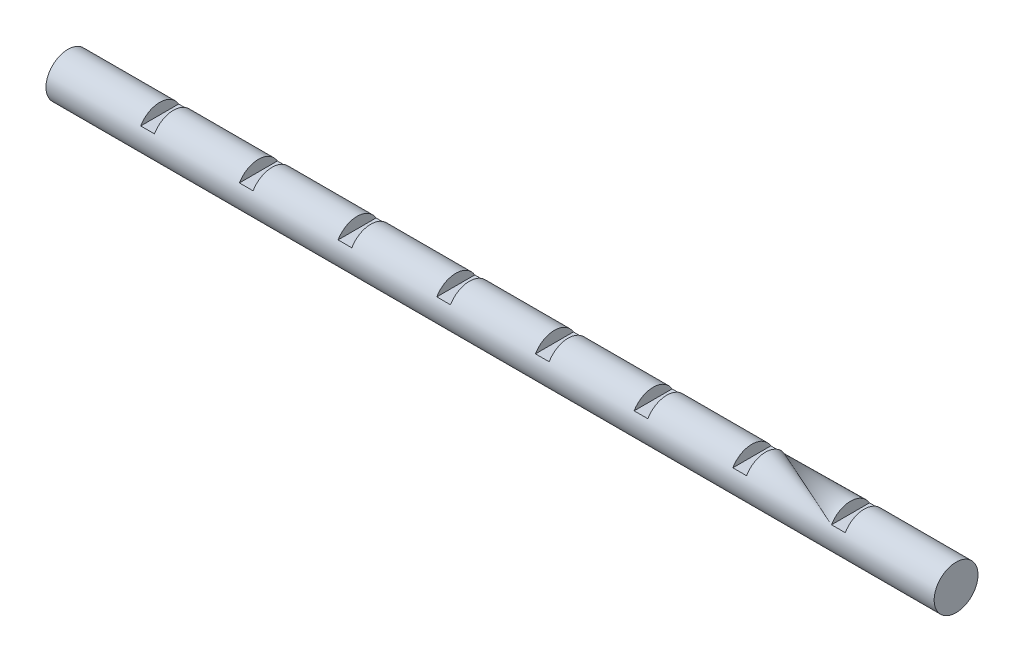
ISO-10303-21;
HEADER;
FILE_DESCRIPTION(('STEP AP214'),'2;1');
FILE_NAME('part.step','',(''),(''),'','','');
FILE_SCHEMA(('AUTOMOTIVE_DESIGN { 1 0 10303 214 1 1 1 1 }'));
ENDSEC;
DATA;
#1=APPLICATION_CONTEXT('core data for automotive mechanical design processes');
#2=APPLICATION_PROTOCOL_DEFINITION('international standard','automotive_design',2000,#1);
#3=PRODUCT_CONTEXT('',#1,'mechanical');
#4=PRODUCT('Part','Part','',(#3));
#5=PRODUCT_RELATED_PRODUCT_CATEGORY('part','',(#4));
#6=PRODUCT_DEFINITION_FORMATION('','',#4);
#7=PRODUCT_DEFINITION_CONTEXT('part definition',#1,'design');
#8=PRODUCT_DEFINITION('design','',#6,#7);
#9=PRODUCT_DEFINITION_SHAPE('','',#8);
#10=(LENGTH_UNIT() NAMED_UNIT(*) SI_UNIT(.MILLI.,.METRE.));
#11=(NAMED_UNIT(*) PLANE_ANGLE_UNIT() SI_UNIT($,.RADIAN.));
#12=(NAMED_UNIT(*) SI_UNIT($,.STERADIAN.) SOLID_ANGLE_UNIT());
#13=UNCERTAINTY_MEASURE_WITH_UNIT(LENGTH_MEASURE(1.E-05),#10,'distance_accuracy_value','');
#14=(GEOMETRIC_REPRESENTATION_CONTEXT(3) GLOBAL_UNCERTAINTY_ASSIGNED_CONTEXT((#13)) GLOBAL_UNIT_ASSIGNED_CONTEXT((#10,
#11,#12)) REPRESENTATION_CONTEXT('',''));
#15=CARTESIAN_POINT('',(0.,0.,0.));
#16=DIRECTION('',(0.,0.,1.));
#17=DIRECTION('',(1.,0.,0.));
#18=AXIS2_PLACEMENT_3D('',#15,#16,#17);
#19=CARTESIAN_POINT('',(81.,0.,0.));
#20=DIRECTION('',(-1.,0.,0.));
#21=DIRECTION('',(0.,0.,1.));
#22=AXIS2_PLACEMENT_3D('',#19,#20,#21);
#23=CYLINDRICAL_SURFACE('',#22,4.);
#24=CARTESIAN_POINT('',(64.25,0.,0.));
#25=DIRECTION('',(-1.,0.,0.));
#26=DIRECTION('',(0.,0.,1.));
#27=AXIS2_PLACEMENT_3D('',#24,#25,#26);
#28=CIRCLE('',#27,4.);
#29=CARTESIAN_POINT('',(64.25,2.,3.46410161513775));
#30=VERTEX_POINT('',#29);
#31=CARTESIAN_POINT('',(64.25,2.,-3.46410161513775));
#32=VERTEX_POINT('',#31);
#33=EDGE_CURVE('E42',#30,#32,#28,.T.);
#34=ORIENTED_EDGE('',*,*,#33,.F.);
#35=DIRECTION('',(-1.,0.,0.));
#36=VECTOR('',#35,1.);
#37=CARTESIAN_POINT('',(81.,2.,3.46410161513775));
#38=LINE('',#37,#36);
#39=CARTESIAN_POINT('',(61.75,2.,3.46410161513775));
#40=VERTEX_POINT('',#39);
#41=EDGE_CURVE('E11',#30,#40,#38,.T.);
#42=ORIENTED_EDGE('',*,*,#41,.T.);
#43=CARTESIAN_POINT('',(61.75,0.,0.));
#44=DIRECTION('',(1.,0.,0.));
#45=DIRECTION('',(0.,0.,-1.));
#46=AXIS2_PLACEMENT_3D('',#43,#44,#45);
#47=CIRCLE('',#46,4.);
#48=CARTESIAN_POINT('',(61.75,2.,-3.46410161513775));
#49=VERTEX_POINT('',#48);
#50=EDGE_CURVE('E153',#49,#40,#47,.T.);
#51=ORIENTED_EDGE('',*,*,#50,.F.);
#52=DIRECTION('',(-1.,0.,0.));
#53=VECTOR('',#52,1.);
#54=CARTESIAN_POINT('',(81.,2.,-3.46410161513775));
#55=LINE('',#54,#53);
#56=EDGE_CURVE('E146',#49,#32,#55,.F.);
#57=ORIENTED_EDGE('',*,*,#56,.T.);
#58=EDGE_LOOP('',(#34,#42,#51,#57));
#59=FACE_BOUND('',#58,.T.);
#60=CARTESIAN_POINT('',(46.25,0.,0.));
#61=DIRECTION('',(-1.,0.,0.));
#62=DIRECTION('',(0.,0.,1.));
#63=AXIS2_PLACEMENT_3D('',#60,#61,#62);
#64=CIRCLE('',#63,4.);
#65=CARTESIAN_POINT('',(46.25,2.,3.46410161513775));
#66=VERTEX_POINT('',#65);
#67=CARTESIAN_POINT('',(46.25,2.,-3.46410161513775));
#68=VERTEX_POINT('',#67);
#69=EDGE_CURVE('E164',#66,#68,#64,.T.);
#70=ORIENTED_EDGE('',*,*,#69,.F.);
#71=DIRECTION('',(-1.,0.,0.));
#72=VECTOR('',#71,1.);
#73=CARTESIAN_POINT('',(81.,2.,3.46410161513775));
#74=LINE('',#73,#72);
#75=CARTESIAN_POINT('',(43.75,2.,3.46410161513775));
#76=VERTEX_POINT('',#75);
#77=EDGE_CURVE('E154',#66,#76,#74,.T.);
#78=ORIENTED_EDGE('',*,*,#77,.T.);
#79=CARTESIAN_POINT('',(43.75,0.,0.));
#80=DIRECTION('',(1.,0.,0.));
#81=DIRECTION('',(0.,0.,-1.));
#82=AXIS2_PLACEMENT_3D('',#79,#80,#81);
#83=CIRCLE('',#82,4.);
#84=CARTESIAN_POINT('',(43.75,2.,-3.46410161513775));
#85=VERTEX_POINT('',#84);
#86=EDGE_CURVE('E166',#85,#76,#83,.T.);
#87=ORIENTED_EDGE('',*,*,#86,.F.);
#88=DIRECTION('',(-1.,0.,0.));
#89=VECTOR('',#88,1.);
#90=CARTESIAN_POINT('',(81.,2.,-3.46410161513775));
#91=LINE('',#90,#89);
#92=EDGE_CURVE('E168',#85,#68,#91,.F.);
#93=ORIENTED_EDGE('',*,*,#92,.T.);
#94=EDGE_LOOP('',(#70,#78,#87,#93));
#95=FACE_BOUND('',#94,.T.);
#96=CARTESIAN_POINT('',(28.25,0.,0.));
#97=DIRECTION('',(-1.,0.,0.));
#98=DIRECTION('',(0.,0.,1.));
#99=AXIS2_PLACEMENT_3D('',#96,#97,#98);
#100=CIRCLE('',#99,4.);
#101=CARTESIAN_POINT('',(28.25,2.,3.46410161513775));
#102=VERTEX_POINT('',#101);
#103=CARTESIAN_POINT('',(28.25,2.,-3.46410161513775));
#104=VERTEX_POINT('',#103);
#105=EDGE_CURVE('E174',#102,#104,#100,.T.);
#106=ORIENTED_EDGE('',*,*,#105,.F.);
#107=DIRECTION('',(-1.,0.,0.));
#108=VECTOR('',#107,1.);
#109=CARTESIAN_POINT('',(81.,2.,3.46410161513775));
#110=LINE('',#109,#108);
#111=CARTESIAN_POINT('',(25.75,2.,3.46410161513775));
#112=VERTEX_POINT('',#111);
#113=EDGE_CURVE('E171',#102,#112,#110,.T.);
#114=ORIENTED_EDGE('',*,*,#113,.T.);
#115=CARTESIAN_POINT('',(25.75,0.,0.));
#116=DIRECTION('',(1.,0.,0.));
#117=DIRECTION('',(0.,0.,-1.));
#118=AXIS2_PLACEMENT_3D('',#115,#116,#117);
#119=CIRCLE('',#118,4.);
#120=CARTESIAN_POINT('',(25.75,2.,-3.46410161513775));
#121=VERTEX_POINT('',#120);
#122=EDGE_CURVE('E177',#121,#112,#119,.T.);
#123=ORIENTED_EDGE('',*,*,#122,.F.);
#124=DIRECTION('',(-1.,0.,0.));
#125=VECTOR('',#124,1.);
#126=CARTESIAN_POINT('',(81.,2.,-3.46410161513775));
#127=LINE('',#126,#125);
#128=EDGE_CURVE('E179',#121,#104,#127,.F.);
#129=ORIENTED_EDGE('',*,*,#128,.T.);
#130=EDGE_LOOP('',(#106,#114,#123,#129));
#131=FACE_BOUND('',#130,.T.);
#132=CARTESIAN_POINT('',(10.25,0.,0.));
#133=DIRECTION('',(-1.,0.,0.));
#134=DIRECTION('',(0.,0.,1.));
#135=AXIS2_PLACEMENT_3D('',#132,#133,#134);
#136=CIRCLE('',#135,4.);
#137=CARTESIAN_POINT('',(10.25,2.,3.46410161513775));
#138=VERTEX_POINT('',#137);
#139=CARTESIAN_POINT('',(10.25,2.,-3.46410161513775));
#140=VERTEX_POINT('',#139);
#141=EDGE_CURVE('E185',#138,#140,#136,.T.);
#142=ORIENTED_EDGE('',*,*,#141,.F.);
#143=DIRECTION('',(-1.,0.,0.));
#144=VECTOR('',#143,1.);
#145=CARTESIAN_POINT('',(81.,2.,3.46410161513775));
#146=LINE('',#145,#144);
#147=CARTESIAN_POINT('',(7.74999999999999,2.,3.46410161513775));
#148=VERTEX_POINT('',#147);
#149=EDGE_CURVE('E182',#138,#148,#146,.T.);
#150=ORIENTED_EDGE('',*,*,#149,.T.);
#151=CARTESIAN_POINT('',(7.74999999999999,0.,0.));
#152=DIRECTION('',(1.,0.,0.));
#153=DIRECTION('',(0.,0.,-1.));
#154=AXIS2_PLACEMENT_3D('',#151,#152,#153);
#155=CIRCLE('',#154,4.);
#156=CARTESIAN_POINT('',(7.74999999999999,2.,-3.46410161513775));
#157=VERTEX_POINT('',#156);
#158=EDGE_CURVE('E188',#157,#148,#155,.T.);
#159=ORIENTED_EDGE('',*,*,#158,.F.);
#160=DIRECTION('',(-1.,0.,0.));
#161=VECTOR('',#160,1.);
#162=CARTESIAN_POINT('',(81.,2.,-3.46410161513775));
#163=LINE('',#162,#161);
#164=EDGE_CURVE('E190',#157,#140,#163,.F.);
#165=ORIENTED_EDGE('',*,*,#164,.T.);
#166=EDGE_LOOP('',(#142,#150,#159,#165));
#167=FACE_BOUND('',#166,.T.);
#168=CARTESIAN_POINT('',(-7.75000000000001,0.,0.));
#169=DIRECTION('',(-1.,0.,0.));
#170=DIRECTION('',(0.,0.,1.));
#171=AXIS2_PLACEMENT_3D('',#168,#169,#170);
#172=CIRCLE('',#171,4.);
#173=CARTESIAN_POINT('',(-7.75000000000001,2.,3.46410161513775));
#174=VERTEX_POINT('',#173);
#175=CARTESIAN_POINT('',(-7.75000000000001,2.,-3.46410161513775));
#176=VERTEX_POINT('',#175);
#177=EDGE_CURVE('E196',#174,#176,#172,.T.);
#178=ORIENTED_EDGE('',*,*,#177,.F.);
#179=DIRECTION('',(-1.,0.,0.));
#180=VECTOR('',#179,1.);
#181=CARTESIAN_POINT('',(81.,2.,3.46410161513775));
#182=LINE('',#181,#180);
#183=CARTESIAN_POINT('',(-10.25,2.,3.46410161513775));
#184=VERTEX_POINT('',#183);
#185=EDGE_CURVE('E193',#174,#184,#182,.T.);
#186=ORIENTED_EDGE('',*,*,#185,.T.);
#187=CARTESIAN_POINT('',(-10.25,0.,0.));
#188=DIRECTION('',(1.,0.,0.));
#189=DIRECTION('',(0.,0.,-1.));
#190=AXIS2_PLACEMENT_3D('',#187,#188,#189);
#191=CIRCLE('',#190,4.);
#192=CARTESIAN_POINT('',(-10.25,2.,-3.46410161513775));
#193=VERTEX_POINT('',#192);
#194=EDGE_CURVE('E199',#193,#184,#191,.T.);
#195=ORIENTED_EDGE('',*,*,#194,.F.);
#196=DIRECTION('',(-1.,0.,0.));
#197=VECTOR('',#196,1.);
#198=CARTESIAN_POINT('',(81.,2.,-3.46410161513775));
#199=LINE('',#198,#197);
#200=EDGE_CURVE('E201',#193,#176,#199,.F.);
#201=ORIENTED_EDGE('',*,*,#200,.T.);
#202=EDGE_LOOP('',(#178,#186,#195,#201));
#203=FACE_BOUND('',#202,.T.);
#204=CARTESIAN_POINT('',(-25.75,0.,0.));
#205=DIRECTION('',(-1.,0.,0.));
#206=DIRECTION('',(0.,0.,1.));
#207=AXIS2_PLACEMENT_3D('',#204,#205,#206);
#208=CIRCLE('',#207,4.);
#209=CARTESIAN_POINT('',(-25.75,2.,3.46410161513775));
#210=VERTEX_POINT('',#209);
#211=CARTESIAN_POINT('',(-25.75,2.,-3.46410161513775));
#212=VERTEX_POINT('',#211);
#213=EDGE_CURVE('E207',#210,#212,#208,.T.);
#214=ORIENTED_EDGE('',*,*,#213,.F.);
#215=DIRECTION('',(-1.,0.,0.));
#216=VECTOR('',#215,1.);
#217=CARTESIAN_POINT('',(81.,2.,3.46410161513775));
#218=LINE('',#217,#216);
#219=CARTESIAN_POINT('',(-28.25,2.,3.46410161513775));
#220=VERTEX_POINT('',#219);
#221=EDGE_CURVE('E204',#210,#220,#218,.T.);
#222=ORIENTED_EDGE('',*,*,#221,.T.);
#223=CARTESIAN_POINT('',(-28.25,0.,0.));
#224=DIRECTION('',(1.,0.,0.));
#225=DIRECTION('',(0.,0.,-1.));
#226=AXIS2_PLACEMENT_3D('',#223,#224,#225);
#227=CIRCLE('',#226,4.);
#228=CARTESIAN_POINT('',(-28.25,2.,-3.46410161513775));
#229=VERTEX_POINT('',#228);
#230=EDGE_CURVE('E210',#229,#220,#227,.T.);
#231=ORIENTED_EDGE('',*,*,#230,.F.);
#232=DIRECTION('',(-1.,0.,0.));
#233=VECTOR('',#232,1.);
#234=CARTESIAN_POINT('',(81.,2.,-3.46410161513775));
#235=LINE('',#234,#233);
#236=EDGE_CURVE('E212',#229,#212,#235,.F.);
#237=ORIENTED_EDGE('',*,*,#236,.T.);
#238=EDGE_LOOP('',(#214,#222,#231,#237));
#239=FACE_BOUND('',#238,.T.);
#240=CARTESIAN_POINT('',(-43.75,0.,0.));
#241=DIRECTION('',(-1.,0.,0.));
#242=DIRECTION('',(0.,0.,1.));
#243=AXIS2_PLACEMENT_3D('',#240,#241,#242);
#244=CIRCLE('',#243,4.);
#245=CARTESIAN_POINT('',(-43.75,2.,3.46410161513775));
#246=VERTEX_POINT('',#245);
#247=CARTESIAN_POINT('',(-43.75,2.,-3.46410161513775));
#248=VERTEX_POINT('',#247);
#249=EDGE_CURVE('E218',#246,#248,#244,.T.);
#250=ORIENTED_EDGE('',*,*,#249,.F.);
#251=DIRECTION('',(-1.,0.,0.));
#252=VECTOR('',#251,1.);
#253=CARTESIAN_POINT('',(81.,2.,3.46410161513775));
#254=LINE('',#253,#252);
#255=CARTESIAN_POINT('',(-46.25,2.,3.46410161513775));
#256=VERTEX_POINT('',#255);
#257=EDGE_CURVE('E215',#246,#256,#254,.T.);
#258=ORIENTED_EDGE('',*,*,#257,.T.);
#259=CARTESIAN_POINT('',(-46.25,0.,0.));
#260=DIRECTION('',(1.,0.,0.));
#261=DIRECTION('',(0.,0.,-1.));
#262=AXIS2_PLACEMENT_3D('',#259,#260,#261);
#263=CIRCLE('',#262,4.);
#264=CARTESIAN_POINT('',(-46.25,2.,-3.46410161513775));
#265=VERTEX_POINT('',#264);
#266=EDGE_CURVE('E221',#265,#256,#263,.T.);
#267=ORIENTED_EDGE('',*,*,#266,.F.);
#268=DIRECTION('',(-1.,0.,0.));
#269=VECTOR('',#268,1.);
#270=CARTESIAN_POINT('',(81.,2.,-3.46410161513775));
#271=LINE('',#270,#269);
#272=EDGE_CURVE('E223',#265,#248,#271,.F.);
#273=ORIENTED_EDGE('',*,*,#272,.T.);
#274=EDGE_LOOP('',(#250,#258,#267,#273));
#275=FACE_BOUND('',#274,.T.);
#276=CARTESIAN_POINT('',(-81.,0.,0.));
#277=DIRECTION('',(1.,0.,0.));
#278=DIRECTION('',(0.,0.,-1.));
#279=AXIS2_PLACEMENT_3D('',#276,#277,#278);
#280=CIRCLE('',#279,4.);
#281=CARTESIAN_POINT('',(-81.,0.,-4.));
#282=VERTEX_POINT('',#281);
#283=EDGE_CURVE('E236',#282,#282,#280,.T.);
#284=ORIENTED_EDGE('',*,*,#283,.T.);
#285=EDGE_LOOP('',(#284));
#286=FACE_BOUND('',#285,.T.);
#287=CARTESIAN_POINT('',(81.,0.,0.));
#288=DIRECTION('',(1.,0.,0.));
#289=DIRECTION('',(0.,0.,-1.));
#290=AXIS2_PLACEMENT_3D('',#287,#288,#289);
#291=CIRCLE('',#290,4.);
#292=CARTESIAN_POINT('',(81.,0.,-4.));
#293=VERTEX_POINT('',#292);
#294=EDGE_CURVE('E235',#293,#293,#291,.T.);
#295=ORIENTED_EDGE('',*,*,#294,.F.);
#296=EDGE_LOOP('',(#295));
#297=FACE_BOUND('',#296,.T.);
#298=DIRECTION('',(-1.,0.,0.));
#299=VECTOR('',#298,1.);
#300=CARTESIAN_POINT('',(81.,2.,-3.46410161513775));
#301=LINE('',#300,#299);
#302=CARTESIAN_POINT('',(-61.75,2.,-3.46410161513775));
#303=VERTEX_POINT('',#302);
#304=CARTESIAN_POINT('',(-64.25,2.,-3.46410161513775));
#305=VERTEX_POINT('',#304);
#306=EDGE_CURVE('E226',#303,#305,#301,.T.);
#307=ORIENTED_EDGE('',*,*,#306,.F.);
#308=CARTESIAN_POINT('',(-61.75,0.,0.));
#309=DIRECTION('',(-1.,0.,0.));
#310=DIRECTION('',(0.,0.,1.));
#311=AXIS2_PLACEMENT_3D('',#308,#309,#310);
#312=CIRCLE('',#311,4.);
#313=CARTESIAN_POINT('',(-61.75,2.,3.46410161513775));
#314=VERTEX_POINT('',#313);
#315=EDGE_CURVE('E228',#314,#303,#312,.T.);
#316=ORIENTED_EDGE('',*,*,#315,.F.);
#317=DIRECTION('',(-1.,0.,0.));
#318=VECTOR('',#317,1.);
#319=CARTESIAN_POINT('',(81.,2.,3.46410161513775));
#320=LINE('',#319,#318);
#321=CARTESIAN_POINT('',(-64.25,2.,3.46410161513775));
#322=VERTEX_POINT('',#321);
#323=EDGE_CURVE('E233',#322,#314,#320,.F.);
#324=ORIENTED_EDGE('',*,*,#323,.F.);
#325=CARTESIAN_POINT('',(-64.25,0.,0.));
#326=DIRECTION('',(1.,0.,0.));
#327=DIRECTION('',(0.,0.,-1.));
#328=AXIS2_PLACEMENT_3D('',#325,#326,#327);
#329=CIRCLE('',#328,4.);
#330=EDGE_CURVE('E230',#305,#322,#329,.T.);
#331=ORIENTED_EDGE('',*,*,#330,.F.);
#332=EDGE_LOOP('',(#307,#316,#324,#331));
#333=FACE_BOUND('',#332,.T.);
#334=ADVANCED_FACE('F35',(#59,#95,#131,#167,#203,#239,#275,#286,#297,#333),#23,.T.);
#335=CARTESIAN_POINT('',(81.,0.,0.));
#336=DIRECTION('',(1.,0.,0.));
#337=DIRECTION('',(0.,0.,-1.));
#338=AXIS2_PLACEMENT_3D('',#335,#336,#337);
#339=PLANE('',#338);
#340=ORIENTED_EDGE('',*,*,#294,.T.);
#341=EDGE_LOOP('',(#340));
#342=FACE_BOUND('',#341,.T.);
#343=ADVANCED_FACE('F296',(#342),#339,.T.);
#344=CARTESIAN_POINT('',(-81.,0.,0.));
#345=DIRECTION('',(1.,0.,0.));
#346=DIRECTION('',(0.,0.,-1.));
#347=AXIS2_PLACEMENT_3D('',#344,#345,#346);
#348=PLANE('',#347);
#349=ORIENTED_EDGE('',*,*,#283,.F.);
#350=EDGE_LOOP('',(#349));
#351=FACE_BOUND('',#350,.T.);
#352=ADVANCED_FACE('F300',(#351),#348,.F.);
#353=CARTESIAN_POINT('',(-61.75,12.,-4.));
#354=DIRECTION('',(-1.,0.,0.));
#355=DIRECTION('',(0.,0.,1.));
#356=AXIS2_PLACEMENT_3D('',#353,#354,#355);
#357=PLANE('',#356);
#358=ORIENTED_EDGE('',*,*,#315,.T.);
#359=DIRECTION('',(0.,0.,-1.));
#360=VECTOR('',#359,1.);
#361=CARTESIAN_POINT('',(-61.75,2.,-4.));
#362=LINE('',#361,#360);
#363=EDGE_CURVE('E243',#314,#303,#362,.T.);
#364=ORIENTED_EDGE('',*,*,#363,.F.);
#365=EDGE_LOOP('',(#358,#364));
#366=FACE_BOUND('',#365,.T.);
#367=ADVANCED_FACE('F306',(#366),#357,.T.);
#368=CARTESIAN_POINT('',(-64.25,12.,-4.));
#369=DIRECTION('',(1.,0.,0.));
#370=DIRECTION('',(0.,0.,-1.));
#371=AXIS2_PLACEMENT_3D('',#368,#369,#370);
#372=PLANE('',#371);
#373=ORIENTED_EDGE('',*,*,#330,.T.);
#374=DIRECTION('',(0.,0.,1.));
#375=VECTOR('',#374,1.);
#376=CARTESIAN_POINT('',(-64.25,2.,-4.));
#377=LINE('',#376,#375);
#378=EDGE_CURVE('E239',#305,#322,#377,.T.);
#379=ORIENTED_EDGE('',*,*,#378,.F.);
#380=EDGE_LOOP('',(#373,#379));
#381=FACE_BOUND('',#380,.T.);
#382=ADVANCED_FACE('F311',(#381),#372,.T.);
#383=CARTESIAN_POINT('',(0.,2.,0.));
#384=DIRECTION('',(0.,1.,0.));
#385=DIRECTION('',(0.,0.,1.));
#386=AXIS2_PLACEMENT_3D('',#383,#384,#385);
#387=PLANE('',#386);
#388=ORIENTED_EDGE('',*,*,#306,.T.);
#389=ORIENTED_EDGE('',*,*,#378,.T.);
#390=ORIENTED_EDGE('',*,*,#323,.T.);
#391=ORIENTED_EDGE('',*,*,#363,.T.);
#392=EDGE_LOOP('',(#388,#389,#390,#391));
#393=FACE_BOUND('',#392,.T.);
#394=ADVANCED_FACE('F315',(#393),#387,.T.);
#395=CARTESIAN_POINT('',(-43.75,12.,-4.));
#396=DIRECTION('',(-1.,0.,0.));
#397=DIRECTION('',(0.,0.,1.));
#398=AXIS2_PLACEMENT_3D('',#395,#396,#397);
#399=PLANE('',#398);
#400=ORIENTED_EDGE('',*,*,#249,.T.);
#401=DIRECTION('',(0.,0.,-1.));
#402=VECTOR('',#401,1.);
#403=CARTESIAN_POINT('',(-43.75,2.,-4.));
#404=LINE('',#403,#402);
#405=EDGE_CURVE('E249',#246,#248,#404,.T.);
#406=ORIENTED_EDGE('',*,*,#405,.F.);
#407=EDGE_LOOP('',(#400,#406));
#408=FACE_BOUND('',#407,.T.);
#409=ADVANCED_FACE('F319',(#408),#399,.T.);
#410=CARTESIAN_POINT('',(-46.25,12.,-4.));
#411=DIRECTION('',(1.,0.,0.));
#412=DIRECTION('',(0.,0.,-1.));
#413=AXIS2_PLACEMENT_3D('',#410,#411,#412);
#414=PLANE('',#413);
#415=ORIENTED_EDGE('',*,*,#266,.T.);
#416=DIRECTION('',(0.,0.,1.));
#417=VECTOR('',#416,1.);
#418=CARTESIAN_POINT('',(-46.25,2.,-4.));
#419=LINE('',#418,#417);
#420=EDGE_CURVE('E246',#265,#256,#419,.T.);
#421=ORIENTED_EDGE('',*,*,#420,.F.);
#422=EDGE_LOOP('',(#415,#421));
#423=FACE_BOUND('',#422,.T.);
#424=ADVANCED_FACE('F323',(#423),#414,.T.);
#425=CARTESIAN_POINT('',(0.,2.,0.));
#426=DIRECTION('',(0.,-1.,0.));
#427=DIRECTION('',(0.,0.,-1.));
#428=AXIS2_PLACEMENT_3D('',#425,#426,#427);
#429=PLANE('',#428);
#430=ORIENTED_EDGE('',*,*,#405,.T.);
#431=ORIENTED_EDGE('',*,*,#272,.F.);
#432=ORIENTED_EDGE('',*,*,#420,.T.);
#433=ORIENTED_EDGE('',*,*,#257,.F.);
#434=EDGE_LOOP('',(#430,#431,#432,#433));
#435=FACE_BOUND('',#434,.T.);
#436=ADVANCED_FACE('F327',(#435),#429,.F.);
#437=CARTESIAN_POINT('',(-25.75,12.,-4.));
#438=DIRECTION('',(-1.,0.,0.));
#439=DIRECTION('',(0.,0.,1.));
#440=AXIS2_PLACEMENT_3D('',#437,#438,#439);
#441=PLANE('',#440);
#442=ORIENTED_EDGE('',*,*,#213,.T.);
#443=DIRECTION('',(0.,0.,-1.));
#444=VECTOR('',#443,1.);
#445=CARTESIAN_POINT('',(-25.75,2.,-4.));
#446=LINE('',#445,#444);
#447=EDGE_CURVE('E254',#210,#212,#446,.T.);
#448=ORIENTED_EDGE('',*,*,#447,.F.);
#449=EDGE_LOOP('',(#442,#448));
#450=FACE_BOUND('',#449,.T.);
#451=ADVANCED_FACE('F331',(#450),#441,.T.);
#452=CARTESIAN_POINT('',(-28.25,12.,-4.));
#453=DIRECTION('',(1.,0.,0.));
#454=DIRECTION('',(0.,0.,-1.));
#455=AXIS2_PLACEMENT_3D('',#452,#453,#454);
#456=PLANE('',#455);
#457=ORIENTED_EDGE('',*,*,#230,.T.);
#458=DIRECTION('',(0.,0.,1.));
#459=VECTOR('',#458,1.);
#460=CARTESIAN_POINT('',(-28.25,2.,-4.));
#461=LINE('',#460,#459);
#462=EDGE_CURVE('E251',#229,#220,#461,.T.);
#463=ORIENTED_EDGE('',*,*,#462,.F.);
#464=EDGE_LOOP('',(#457,#463));
#465=FACE_BOUND('',#464,.T.);
#466=ADVANCED_FACE('F335',(#465),#456,.T.);
#467=CARTESIAN_POINT('',(0.,2.,0.));
#468=DIRECTION('',(0.,-1.,0.));
#469=DIRECTION('',(0.,0.,-1.));
#470=AXIS2_PLACEMENT_3D('',#467,#468,#469);
#471=PLANE('',#470);
#472=ORIENTED_EDGE('',*,*,#447,.T.);
#473=ORIENTED_EDGE('',*,*,#236,.F.);
#474=ORIENTED_EDGE('',*,*,#462,.T.);
#475=ORIENTED_EDGE('',*,*,#221,.F.);
#476=EDGE_LOOP('',(#472,#473,#474,#475));
#477=FACE_BOUND('',#476,.T.);
#478=ADVANCED_FACE('F339',(#477),#471,.F.);
#479=CARTESIAN_POINT('',(-7.75000000000001,12.,-4.));
#480=DIRECTION('',(-1.,0.,0.));
#481=DIRECTION('',(0.,0.,1.));
#482=AXIS2_PLACEMENT_3D('',#479,#480,#481);
#483=PLANE('',#482);
#484=ORIENTED_EDGE('',*,*,#177,.T.);
#485=DIRECTION('',(0.,0.,-1.));
#486=VECTOR('',#485,1.);
#487=CARTESIAN_POINT('',(-7.75000000000001,2.,-4.));
#488=LINE('',#487,#486);
#489=EDGE_CURVE('E259',#174,#176,#488,.T.);
#490=ORIENTED_EDGE('',*,*,#489,.F.);
#491=EDGE_LOOP('',(#484,#490));
#492=FACE_BOUND('',#491,.T.);
#493=ADVANCED_FACE('F343',(#492),#483,.T.);
#494=CARTESIAN_POINT('',(-10.25,12.,-4.));
#495=DIRECTION('',(1.,0.,0.));
#496=DIRECTION('',(0.,0.,-1.));
#497=AXIS2_PLACEMENT_3D('',#494,#495,#496);
#498=PLANE('',#497);
#499=ORIENTED_EDGE('',*,*,#194,.T.);
#500=DIRECTION('',(0.,0.,1.));
#501=VECTOR('',#500,1.);
#502=CARTESIAN_POINT('',(-10.25,2.,-4.));
#503=LINE('',#502,#501);
#504=EDGE_CURVE('E256',#193,#184,#503,.T.);
#505=ORIENTED_EDGE('',*,*,#504,.F.);
#506=EDGE_LOOP('',(#499,#505));
#507=FACE_BOUND('',#506,.T.);
#508=ADVANCED_FACE('F347',(#507),#498,.T.);
#509=CARTESIAN_POINT('',(0.,2.,0.));
#510=DIRECTION('',(0.,-1.,0.));
#511=DIRECTION('',(0.,0.,-1.));
#512=AXIS2_PLACEMENT_3D('',#509,#510,#511);
#513=PLANE('',#512);
#514=ORIENTED_EDGE('',*,*,#489,.T.);
#515=ORIENTED_EDGE('',*,*,#200,.F.);
#516=ORIENTED_EDGE('',*,*,#504,.T.);
#517=ORIENTED_EDGE('',*,*,#185,.F.);
#518=EDGE_LOOP('',(#514,#515,#516,#517));
#519=FACE_BOUND('',#518,.T.);
#520=ADVANCED_FACE('F351',(#519),#513,.F.);
#521=CARTESIAN_POINT('',(10.25,12.,-4.));
#522=DIRECTION('',(-1.,0.,0.));
#523=DIRECTION('',(0.,0.,1.));
#524=AXIS2_PLACEMENT_3D('',#521,#522,#523);
#525=PLANE('',#524);
#526=ORIENTED_EDGE('',*,*,#141,.T.);
#527=DIRECTION('',(0.,0.,-1.));
#528=VECTOR('',#527,1.);
#529=CARTESIAN_POINT('',(10.25,2.,-4.));
#530=LINE('',#529,#528);
#531=EDGE_CURVE('E264',#138,#140,#530,.T.);
#532=ORIENTED_EDGE('',*,*,#531,.F.);
#533=EDGE_LOOP('',(#526,#532));
#534=FACE_BOUND('',#533,.T.);
#535=ADVANCED_FACE('F355',(#534),#525,.T.);
#536=CARTESIAN_POINT('',(7.74999999999999,12.,-4.));
#537=DIRECTION('',(1.,0.,0.));
#538=DIRECTION('',(0.,0.,-1.));
#539=AXIS2_PLACEMENT_3D('',#536,#537,#538);
#540=PLANE('',#539);
#541=ORIENTED_EDGE('',*,*,#158,.T.);
#542=DIRECTION('',(0.,0.,1.));
#543=VECTOR('',#542,1.);
#544=CARTESIAN_POINT('',(7.74999999999999,2.,-4.));
#545=LINE('',#544,#543);
#546=EDGE_CURVE('E261',#157,#148,#545,.T.);
#547=ORIENTED_EDGE('',*,*,#546,.F.);
#548=EDGE_LOOP('',(#541,#547));
#549=FACE_BOUND('',#548,.T.);
#550=ADVANCED_FACE('F359',(#549),#540,.T.);
#551=CARTESIAN_POINT('',(0.,2.,0.));
#552=DIRECTION('',(0.,-1.,0.));
#553=DIRECTION('',(0.,0.,-1.));
#554=AXIS2_PLACEMENT_3D('',#551,#552,#553);
#555=PLANE('',#554);
#556=ORIENTED_EDGE('',*,*,#531,.T.);
#557=ORIENTED_EDGE('',*,*,#164,.F.);
#558=ORIENTED_EDGE('',*,*,#546,.T.);
#559=ORIENTED_EDGE('',*,*,#149,.F.);
#560=EDGE_LOOP('',(#556,#557,#558,#559));
#561=FACE_BOUND('',#560,.T.);
#562=ADVANCED_FACE('F363',(#561),#555,.F.);
#563=CARTESIAN_POINT('',(28.25,12.,-4.));
#564=DIRECTION('',(-1.,0.,0.));
#565=DIRECTION('',(0.,0.,1.));
#566=AXIS2_PLACEMENT_3D('',#563,#564,#565);
#567=PLANE('',#566);
#568=ORIENTED_EDGE('',*,*,#105,.T.);
#569=DIRECTION('',(0.,0.,-1.));
#570=VECTOR('',#569,1.);
#571=CARTESIAN_POINT('',(28.25,2.,-4.));
#572=LINE('',#571,#570);
#573=EDGE_CURVE('E269',#102,#104,#572,.T.);
#574=ORIENTED_EDGE('',*,*,#573,.F.);
#575=EDGE_LOOP('',(#568,#574));
#576=FACE_BOUND('',#575,.T.);
#577=ADVANCED_FACE('F367',(#576),#567,.T.);
#578=CARTESIAN_POINT('',(25.75,12.,-4.));
#579=DIRECTION('',(1.,0.,0.));
#580=DIRECTION('',(0.,0.,-1.));
#581=AXIS2_PLACEMENT_3D('',#578,#579,#580);
#582=PLANE('',#581);
#583=ORIENTED_EDGE('',*,*,#122,.T.);
#584=DIRECTION('',(0.,0.,1.));
#585=VECTOR('',#584,1.);
#586=CARTESIAN_POINT('',(25.75,2.,-4.));
#587=LINE('',#586,#585);
#588=EDGE_CURVE('E266',#121,#112,#587,.T.);
#589=ORIENTED_EDGE('',*,*,#588,.F.);
#590=EDGE_LOOP('',(#583,#589));
#591=FACE_BOUND('',#590,.T.);
#592=ADVANCED_FACE('F292',(#591),#582,.T.);
#593=CARTESIAN_POINT('',(0.,2.,0.));
#594=DIRECTION('',(0.,-1.,0.));
#595=DIRECTION('',(0.,0.,-1.));
#596=AXIS2_PLACEMENT_3D('',#593,#594,#595);
#597=PLANE('',#596);
#598=ORIENTED_EDGE('',*,*,#573,.T.);
#599=ORIENTED_EDGE('',*,*,#128,.F.);
#600=ORIENTED_EDGE('',*,*,#588,.T.);
#601=ORIENTED_EDGE('',*,*,#113,.F.);
#602=EDGE_LOOP('',(#598,#599,#600,#601));
#603=FACE_BOUND('',#602,.T.);
#604=ADVANCED_FACE('F285',(#603),#597,.F.);
#605=CARTESIAN_POINT('',(46.25,12.,-4.));
#606=DIRECTION('',(-1.,0.,0.));
#607=DIRECTION('',(0.,0.,1.));
#608=AXIS2_PLACEMENT_3D('',#605,#606,#607);
#609=PLANE('',#608);
#610=ORIENTED_EDGE('',*,*,#69,.T.);
#611=DIRECTION('',(0.,0.,-1.));
#612=VECTOR('',#611,1.);
#613=CARTESIAN_POINT('',(46.25,2.,-4.));
#614=LINE('',#613,#612);
#615=EDGE_CURVE('E57',#66,#68,#614,.T.);
#616=ORIENTED_EDGE('',*,*,#615,.F.);
#617=EDGE_LOOP('',(#610,#616));
#618=FACE_BOUND('',#617,.T.);
#619=ADVANCED_FACE('F282',(#618),#609,.T.);
#620=CARTESIAN_POINT('',(43.75,12.,-4.));
#621=DIRECTION('',(1.,0.,0.));
#622=DIRECTION('',(0.,0.,-1.));
#623=AXIS2_PLACEMENT_3D('',#620,#621,#622);
#624=PLANE('',#623);
#625=ORIENTED_EDGE('',*,*,#86,.T.);
#626=DIRECTION('',(0.,0.,1.));
#627=VECTOR('',#626,1.);
#628=CARTESIAN_POINT('',(43.75,2.,-4.));
#629=LINE('',#628,#627);
#630=EDGE_CURVE('E271',#85,#76,#629,.T.);
#631=ORIENTED_EDGE('',*,*,#630,.F.);
#632=EDGE_LOOP('',(#625,#631));
#633=FACE_BOUND('',#632,.T.);
#634=ADVANCED_FACE('F284',(#633),#624,.T.);
#635=CARTESIAN_POINT('',(0.,2.,0.));
#636=DIRECTION('',(0.,-1.,0.));
#637=DIRECTION('',(0.,0.,-1.));
#638=AXIS2_PLACEMENT_3D('',#635,#636,#637);
#639=PLANE('',#638);
#640=ORIENTED_EDGE('',*,*,#615,.T.);
#641=ORIENTED_EDGE('',*,*,#92,.F.);
#642=ORIENTED_EDGE('',*,*,#630,.T.);
#643=ORIENTED_EDGE('',*,*,#77,.F.);
#644=EDGE_LOOP('',(#640,#641,#642,#643));
#645=FACE_BOUND('',#644,.T.);
#646=ADVANCED_FACE('F276',(#645),#639,.F.);
#647=CARTESIAN_POINT('',(64.25,12.,-4.));
#648=DIRECTION('',(-1.,0.,0.));
#649=DIRECTION('',(0.,0.,1.));
#650=AXIS2_PLACEMENT_3D('',#647,#648,#649);
#651=PLANE('',#650);
#652=ORIENTED_EDGE('',*,*,#33,.T.);
#653=DIRECTION('',(0.,0.,-1.));
#654=VECTOR('',#653,1.);
#655=CARTESIAN_POINT('',(64.25,2.,-4.));
#656=LINE('',#655,#654);
#657=EDGE_CURVE('E49',#30,#32,#656,.T.);
#658=ORIENTED_EDGE('',*,*,#657,.F.);
#659=EDGE_LOOP('',(#652,#658));
#660=FACE_BOUND('',#659,.T.);
#661=ADVANCED_FACE('F436',(#660),#651,.T.);
#662=CARTESIAN_POINT('',(61.75,12.,-4.));
#663=DIRECTION('',(1.,0.,0.));
#664=DIRECTION('',(0.,0.,-1.));
#665=AXIS2_PLACEMENT_3D('',#662,#663,#664);
#666=PLANE('',#665);
#667=ORIENTED_EDGE('',*,*,#50,.T.);
#668=DIRECTION('',(0.,0.,1.));
#669=VECTOR('',#668,1.);
#670=CARTESIAN_POINT('',(61.75,2.,-4.));
#671=LINE('',#670,#669);
#672=EDGE_CURVE('E149',#49,#40,#671,.T.);
#673=ORIENTED_EDGE('',*,*,#672,.F.);
#674=EDGE_LOOP('',(#667,#673));
#675=FACE_BOUND('',#674,.T.);
#676=ADVANCED_FACE('F157',(#675),#666,.T.);
#677=CARTESIAN_POINT('',(0.,2.,0.));
#678=DIRECTION('',(0.,-1.,0.));
#679=DIRECTION('',(0.,0.,-1.));
#680=AXIS2_PLACEMENT_3D('',#677,#678,#679);
#681=PLANE('',#680);
#682=ORIENTED_EDGE('',*,*,#657,.T.);
#683=ORIENTED_EDGE('',*,*,#56,.F.);
#684=ORIENTED_EDGE('',*,*,#672,.T.);
#685=ORIENTED_EDGE('',*,*,#41,.F.);
#686=EDGE_LOOP('',(#682,#683,#684,#685));
#687=FACE_BOUND('',#686,.T.);
#688=ADVANCED_FACE('F148',(#687),#681,.F.);
#689=CLOSED_SHELL('',(#334,#343,#352,#367,#382,#394,#409,#424,#436,#451,#466,#478,#493,#508,
#520,#535,#550,#562,#577,#592,#604,#619,#634,#646,#661,#676,#688));
#690=MANIFOLD_SOLID_BREP('B2',#689);
#691=ADVANCED_BREP_SHAPE_REPRESENTATION('',(#18,#690),#14);
#692=SHAPE_DEFINITION_REPRESENTATION(#9,#691);
ENDSEC;
END-ISO-10303-21;
